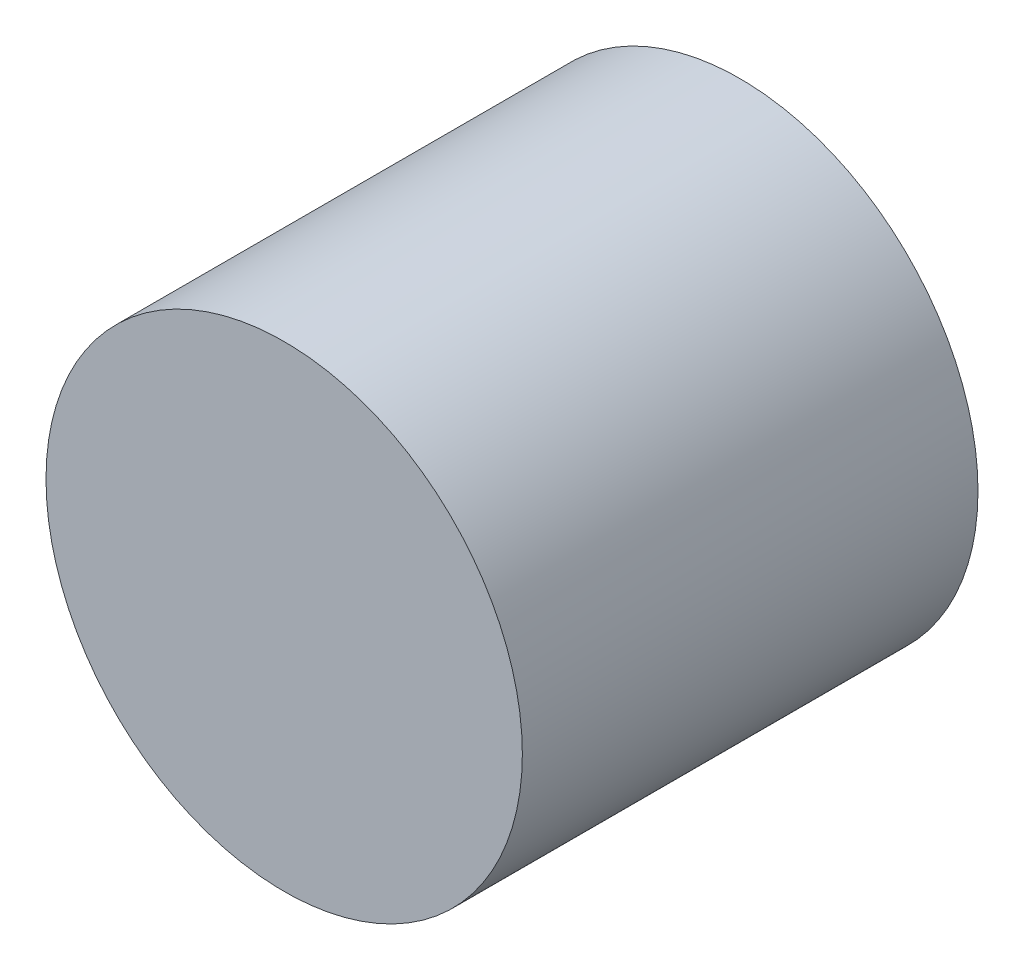
ISO-10303-21;
HEADER;
FILE_DESCRIPTION(('STEP AP214'),'2;1');
FILE_NAME('part.step','',(''),(''),'','','');
FILE_SCHEMA(('AUTOMOTIVE_DESIGN { 1 0 10303 214 1 1 1 1 }'));
ENDSEC;
DATA;
#1=APPLICATION_CONTEXT('core data for automotive mechanical design processes');
#2=APPLICATION_PROTOCOL_DEFINITION('international standard','automotive_design',2000,#1);
#3=PRODUCT_CONTEXT('',#1,'mechanical');
#4=PRODUCT('Part','Part','',(#3));
#5=PRODUCT_RELATED_PRODUCT_CATEGORY('part','',(#4));
#6=PRODUCT_DEFINITION_FORMATION('','',#4);
#7=PRODUCT_DEFINITION_CONTEXT('part definition',#1,'design');
#8=PRODUCT_DEFINITION('design','',#6,#7);
#9=PRODUCT_DEFINITION_SHAPE('','',#8);
#10=(LENGTH_UNIT() NAMED_UNIT(*) SI_UNIT(.MILLI.,.METRE.));
#11=(NAMED_UNIT(*) PLANE_ANGLE_UNIT() SI_UNIT($,.RADIAN.));
#12=(NAMED_UNIT(*) SI_UNIT($,.STERADIAN.) SOLID_ANGLE_UNIT());
#13=UNCERTAINTY_MEASURE_WITH_UNIT(LENGTH_MEASURE(1.E-05),#10,'distance_accuracy_value','');
#14=(GEOMETRIC_REPRESENTATION_CONTEXT(3) GLOBAL_UNCERTAINTY_ASSIGNED_CONTEXT((#13)) GLOBAL_UNIT_ASSIGNED_CONTEXT((#10,
#11,#12)) REPRESENTATION_CONTEXT('',''));
#15=CARTESIAN_POINT('',(0.,0.,0.));
#16=DIRECTION('',(0.,0.,1.));
#17=DIRECTION('',(1.,0.,0.));
#18=AXIS2_PLACEMENT_3D('',#15,#16,#17);
#19=CARTESIAN_POINT('',(0.,0.,44.));
#20=DIRECTION('',(0.,0.,-1.));
#21=DIRECTION('',(-1.,0.,0.));
#22=AXIS2_PLACEMENT_3D('',#19,#20,#21);
#23=CYLINDRICAL_SURFACE('',#22,23.);
#24=CARTESIAN_POINT('',(0.,0.,44.));
#25=DIRECTION('',(0.,0.,1.));
#26=DIRECTION('',(1.,0.,0.));
#27=AXIS2_PLACEMENT_3D('',#24,#25,#26);
#28=CIRCLE('',#27,23.);
#29=CARTESIAN_POINT('',(23.,0.,44.));
#30=VERTEX_POINT('',#29);
#31=EDGE_CURVE('E10',#30,#30,#28,.T.);
#32=ORIENTED_EDGE('',*,*,#31,.F.);
#33=EDGE_LOOP('',(#32));
#34=FACE_BOUND('',#33,.T.);
#35=CARTESIAN_POINT('',(0.,0.,0.));
#36=DIRECTION('',(0.,0.,1.));
#37=DIRECTION('',(1.,0.,0.));
#38=AXIS2_PLACEMENT_3D('',#35,#36,#37);
#39=CIRCLE('',#38,23.);
#40=CARTESIAN_POINT('',(23.,0.,0.));
#41=VERTEX_POINT('',#40);
#42=EDGE_CURVE('E43',#41,#41,#39,.T.);
#43=ORIENTED_EDGE('',*,*,#42,.T.);
#44=EDGE_LOOP('',(#43));
#45=FACE_BOUND('',#44,.T.);
#46=ADVANCED_FACE('F40',(#34,#45),#23,.T.);
#47=CARTESIAN_POINT('',(0.,0.,44.));
#48=DIRECTION('',(0.,0.,1.));
#49=DIRECTION('',(1.,0.,0.));
#50=AXIS2_PLACEMENT_3D('',#47,#48,#49);
#51=PLANE('',#50);
#52=ORIENTED_EDGE('',*,*,#31,.T.);
#53=EDGE_LOOP('',(#52));
#54=FACE_BOUND('',#53,.T.);
#55=ADVANCED_FACE('F55',(#54),#51,.T.);
#56=CARTESIAN_POINT('',(0.,0.,0.));
#57=DIRECTION('',(0.,0.,1.));
#58=DIRECTION('',(1.,0.,0.));
#59=AXIS2_PLACEMENT_3D('',#56,#57,#58);
#60=PLANE('',#59);
#61=ORIENTED_EDGE('',*,*,#42,.F.);
#62=EDGE_LOOP('',(#61));
#63=FACE_BOUND('',#62,.T.);
#64=ADVANCED_FACE('F53',(#63),#60,.F.);
#65=CLOSED_SHELL('',(#46,#55,#64));
#66=MANIFOLD_SOLID_BREP('B2',#65);
#67=ADVANCED_BREP_SHAPE_REPRESENTATION('',(#18,#66),#14);
#68=SHAPE_DEFINITION_REPRESENTATION(#9,#67);
ENDSEC;
END-ISO-10303-21;
